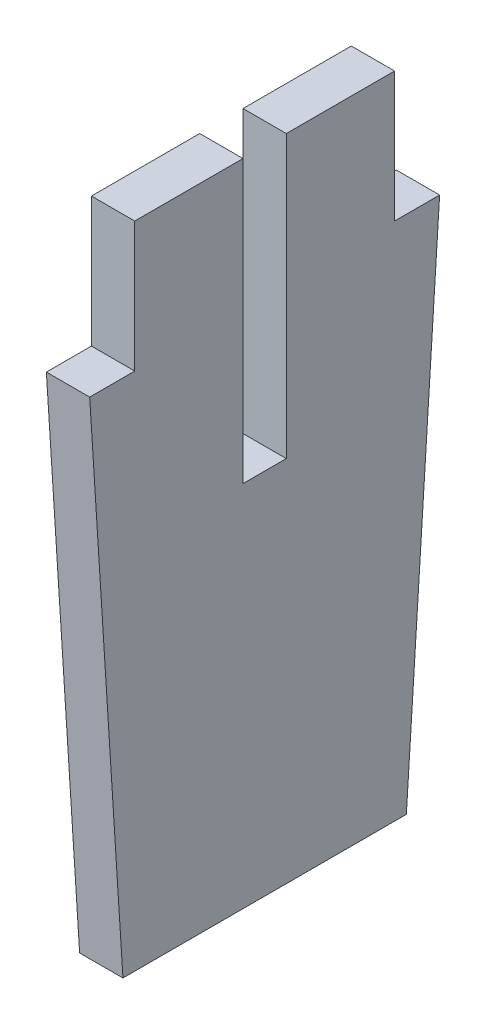
ISO-10303-21;
HEADER;
FILE_DESCRIPTION(('STEP AP214'),'2;1');
FILE_NAME('part.step','',(''),(''),'','','');
FILE_SCHEMA(('AUTOMOTIVE_DESIGN { 1 0 10303 214 1 1 1 1 }'));
ENDSEC;
DATA;
#1=APPLICATION_CONTEXT('core data for automotive mechanical design processes');
#2=APPLICATION_PROTOCOL_DEFINITION('international standard','automotive_design',2000,#1);
#3=PRODUCT_CONTEXT('',#1,'mechanical');
#4=PRODUCT('Part','Part','',(#3));
#5=PRODUCT_RELATED_PRODUCT_CATEGORY('part','',(#4));
#6=PRODUCT_DEFINITION_FORMATION('','',#4);
#7=PRODUCT_DEFINITION_CONTEXT('part definition',#1,'design');
#8=PRODUCT_DEFINITION('design','',#6,#7);
#9=PRODUCT_DEFINITION_SHAPE('','',#8);
#10=(LENGTH_UNIT() NAMED_UNIT(*) SI_UNIT(.MILLI.,.METRE.));
#11=(NAMED_UNIT(*) PLANE_ANGLE_UNIT() SI_UNIT($,.RADIAN.));
#12=(NAMED_UNIT(*) SI_UNIT($,.STERADIAN.) SOLID_ANGLE_UNIT());
#13=UNCERTAINTY_MEASURE_WITH_UNIT(LENGTH_MEASURE(1.E-05),#10,'distance_accuracy_value','');
#14=(GEOMETRIC_REPRESENTATION_CONTEXT(3) GLOBAL_UNCERTAINTY_ASSIGNED_CONTEXT((#13)) GLOBAL_UNIT_ASSIGNED_CONTEXT((#10,
#11,#12)) REPRESENTATION_CONTEXT('',''));
#15=CARTESIAN_POINT('',(0.,0.,0.));
#16=DIRECTION('',(0.,0.,1.));
#17=DIRECTION('',(1.,0.,0.));
#18=AXIS2_PLACEMENT_3D('',#15,#16,#17);
#19=CARTESIAN_POINT('',(3.175,47.625,0.));
#20=DIRECTION('',(0.,0.,-1.));
#21=DIRECTION('',(-1.,0.,0.));
#22=AXIS2_PLACEMENT_3D('',#19,#20,#21);
#23=PLANE('',#22);
#24=DIRECTION('',(0.,-1.,0.));
#25=VECTOR('',#24,1.);
#26=CARTESIAN_POINT('',(0.,47.625,0.));
#27=LINE('',#26,#25);
#28=CARTESIAN_POINT('',(0.,47.625,0.));
#29=VERTEX_POINT('',#28);
#30=CARTESIAN_POINT('',(0.,38.1,0.));
#31=VERTEX_POINT('',#30);
#32=EDGE_CURVE('E153',#29,#31,#27,.T.);
#33=ORIENTED_EDGE('',*,*,#32,.T.);
#34=DIRECTION('',(-1.,0.,0.));
#35=VECTOR('',#34,1.);
#36=CARTESIAN_POINT('',(3.175,38.1,0.));
#37=LINE('',#36,#35);
#38=CARTESIAN_POINT('',(3.175,38.1,0.));
#39=VERTEX_POINT('',#38);
#40=EDGE_CURVE('E11',#39,#31,#37,.T.);
#41=ORIENTED_EDGE('',*,*,#40,.F.);
#42=DIRECTION('',(0.,-1.,0.));
#43=VECTOR('',#42,1.);
#44=CARTESIAN_POINT('',(3.175,47.625,0.));
#45=LINE('',#44,#43);
#46=CARTESIAN_POINT('',(3.175,47.625,0.));
#47=VERTEX_POINT('',#46);
#48=EDGE_CURVE('E177',#47,#39,#45,.T.);
#49=ORIENTED_EDGE('',*,*,#48,.F.);
#50=DIRECTION('',(-1.,0.,0.));
#51=VECTOR('',#50,1.);
#52=CARTESIAN_POINT('',(3.175,47.625,0.));
#53=LINE('',#52,#51);
#54=EDGE_CURVE('E149',#47,#29,#53,.T.);
#55=ORIENTED_EDGE('',*,*,#54,.T.);
#56=EDGE_LOOP('',(#33,#41,#49,#55));
#57=FACE_BOUND('',#56,.T.);
#58=ADVANCED_FACE('F33',(#57),#23,.F.);
#59=CARTESIAN_POINT('',(3.175,38.1,0.));
#60=DIRECTION('',(0.,-1.,0.));
#61=DIRECTION('',(0.,0.,-1.));
#62=AXIS2_PLACEMENT_3D('',#59,#60,#61);
#63=PLANE('',#62);
#64=DIRECTION('',(0.,0.,1.));
#65=VECTOR('',#64,1.);
#66=CARTESIAN_POINT('',(0.,38.1,0.));
#67=LINE('',#66,#65);
#68=CARTESIAN_POINT('',(0.,38.1,3.302));
#69=VERTEX_POINT('',#68);
#70=EDGE_CURVE('E156',#31,#69,#67,.T.);
#71=ORIENTED_EDGE('',*,*,#70,.T.);
#72=DIRECTION('',(-1.,0.,0.));
#73=VECTOR('',#72,1.);
#74=CARTESIAN_POINT('',(3.175,38.1,3.302));
#75=LINE('',#74,#73);
#76=CARTESIAN_POINT('',(3.175,38.1,3.302));
#77=VERTEX_POINT('',#76);
#78=EDGE_CURVE('E41',#77,#69,#75,.T.);
#79=ORIENTED_EDGE('',*,*,#78,.F.);
#80=DIRECTION('',(0.,0.,1.));
#81=VECTOR('',#80,1.);
#82=CARTESIAN_POINT('',(3.175,38.1,0.));
#83=LINE('',#82,#81);
#84=EDGE_CURVE('E104',#39,#77,#83,.T.);
#85=ORIENTED_EDGE('',*,*,#84,.F.);
#86=ORIENTED_EDGE('',*,*,#40,.T.);
#87=EDGE_LOOP('',(#71,#79,#85,#86));
#88=FACE_BOUND('',#87,.T.);
#89=ADVANCED_FACE('F204',(#88),#63,.F.);
#90=CARTESIAN_POINT('',(3.175,6.35,1.27000000000001));
#91=DIRECTION('',(0.,0.0638693292837019,-0.997958270057847));
#92=DIRECTION('',(0.,0.997958270057847,0.063869329283702));
#93=AXIS2_PLACEMENT_3D('',#90,#91,#92);
#94=PLANE('',#93);
#95=DIRECTION('',(0.,-0.997958270057847,-0.0638693292837019));
#96=VECTOR('',#95,1.);
#97=CARTESIAN_POINT('',(0.,6.35,1.27000000000001));
#98=LINE('',#97,#96);
#99=CARTESIAN_POINT('',(0.,0.,0.86360000000001));
#100=VERTEX_POINT('',#99);
#101=EDGE_CURVE('E159',#69,#100,#98,.T.);
#102=ORIENTED_EDGE('',*,*,#101,.T.);
#103=DIRECTION('',(-1.,0.,0.));
#104=VECTOR('',#103,1.);
#105=CARTESIAN_POINT('',(3.175,0.,0.86360000000001));
#106=LINE('',#105,#104);
#107=CARTESIAN_POINT('',(3.175,0.,0.86360000000001));
#108=VERTEX_POINT('',#107);
#109=EDGE_CURVE('E196',#108,#100,#106,.T.);
#110=ORIENTED_EDGE('',*,*,#109,.F.);
#111=DIRECTION('',(0.,-0.997958270057847,-0.063869329283702));
#112=VECTOR('',#111,1.);
#113=CARTESIAN_POINT('',(3.175,38.1,3.302));
#114=LINE('',#113,#112);
#115=EDGE_CURVE('E203',#77,#108,#114,.T.);
#116=ORIENTED_EDGE('',*,*,#115,.F.);
#117=ORIENTED_EDGE('',*,*,#78,.T.);
#118=EDGE_LOOP('',(#102,#110,#116,#117));
#119=FACE_BOUND('',#118,.T.);
#120=ADVANCED_FACE('F201',(#119),#94,.F.);
#121=CARTESIAN_POINT('',(3.175,0.,0.86360000000001));
#122=DIRECTION('',(0.,1.,0.));
#123=DIRECTION('',(0.,0.,1.));
#124=AXIS2_PLACEMENT_3D('',#121,#122,#123);
#125=PLANE('',#124);
#126=DIRECTION('',(0.,0.,-1.));
#127=VECTOR('',#126,1.);
#128=CARTESIAN_POINT('',(0.,0.,0.86360000000001));
#129=LINE('',#128,#127);
#130=CARTESIAN_POINT('',(0.,0.,-19.9136));
#131=VERTEX_POINT('',#130);
#132=EDGE_CURVE('E161',#100,#131,#129,.T.);
#133=ORIENTED_EDGE('',*,*,#132,.T.);
#134=DIRECTION('',(-1.,0.,0.));
#135=VECTOR('',#134,1.);
#136=CARTESIAN_POINT('',(3.175,0.,-19.9136));
#137=LINE('',#136,#135);
#138=CARTESIAN_POINT('',(3.175,0.,-19.9136));
#139=VERTEX_POINT('',#138);
#140=EDGE_CURVE('E193',#139,#131,#137,.T.);
#141=ORIENTED_EDGE('',*,*,#140,.F.);
#142=DIRECTION('',(0.,0.,-1.));
#143=VECTOR('',#142,1.);
#144=CARTESIAN_POINT('',(3.175,0.,0.86360000000001));
#145=LINE('',#144,#143);
#146=EDGE_CURVE('E222',#108,#139,#145,.T.);
#147=ORIENTED_EDGE('',*,*,#146,.F.);
#148=ORIENTED_EDGE('',*,*,#109,.T.);
#149=EDGE_LOOP('',(#133,#141,#147,#148));
#150=FACE_BOUND('',#149,.T.);
#151=ADVANCED_FACE('F213',(#150),#125,.F.);
#152=CARTESIAN_POINT('',(3.175,38.1,-22.352));
#153=DIRECTION('',(0.,0.0638693292837024,0.997958270057847));
#154=DIRECTION('',(0.,-0.997958270057847,0.0638693292837024));
#155=AXIS2_PLACEMENT_3D('',#152,#153,#154);
#156=PLANE('',#155);
#157=DIRECTION('',(0.,0.997958270057847,-0.0638693292837024));
#158=VECTOR('',#157,1.);
#159=CARTESIAN_POINT('',(0.,38.1,-22.352));
#160=LINE('',#159,#158);
#161=CARTESIAN_POINT('',(0.,38.1,-22.352));
#162=VERTEX_POINT('',#161);
#163=EDGE_CURVE('E164',#131,#162,#160,.T.);
#164=ORIENTED_EDGE('',*,*,#163,.T.);
#165=DIRECTION('',(-1.,0.,0.));
#166=VECTOR('',#165,1.);
#167=CARTESIAN_POINT('',(3.175,38.1,-22.352));
#168=LINE('',#167,#166);
#169=CARTESIAN_POINT('',(3.175,38.1,-22.352));
#170=VERTEX_POINT('',#169);
#171=EDGE_CURVE('E190',#170,#162,#168,.T.);
#172=ORIENTED_EDGE('',*,*,#171,.F.);
#173=DIRECTION('',(0.,0.997958270057847,-0.0638693292837024));
#174=VECTOR('',#173,1.);
#175=CARTESIAN_POINT('',(3.175,6.35,-20.32));
#176=LINE('',#175,#174);
#177=EDGE_CURVE('E219',#139,#170,#176,.T.);
#178=ORIENTED_EDGE('',*,*,#177,.F.);
#179=ORIENTED_EDGE('',*,*,#140,.T.);
#180=EDGE_LOOP('',(#164,#172,#178,#179));
#181=FACE_BOUND('',#180,.T.);
#182=ADVANCED_FACE('F217',(#181),#156,.F.);
#183=CARTESIAN_POINT('',(3.175,38.1,-19.05));
#184=DIRECTION('',(0.,-1.,0.));
#185=DIRECTION('',(0.,0.,-1.));
#186=AXIS2_PLACEMENT_3D('',#183,#184,#185);
#187=PLANE('',#186);
#188=DIRECTION('',(0.,0.,1.));
#189=VECTOR('',#188,1.);
#190=CARTESIAN_POINT('',(0.,38.1,-19.05));
#191=LINE('',#190,#189);
#192=CARTESIAN_POINT('',(0.,38.1,-19.05));
#193=VERTEX_POINT('',#192);
#194=EDGE_CURVE('E166',#162,#193,#191,.T.);
#195=ORIENTED_EDGE('',*,*,#194,.T.);
#196=DIRECTION('',(-1.,0.,0.));
#197=VECTOR('',#196,1.);
#198=CARTESIAN_POINT('',(3.175,38.1,-19.05));
#199=LINE('',#198,#197);
#200=CARTESIAN_POINT('',(3.175,38.1,-19.05));
#201=VERTEX_POINT('',#200);
#202=EDGE_CURVE('E187',#201,#193,#199,.T.);
#203=ORIENTED_EDGE('',*,*,#202,.F.);
#204=DIRECTION('',(0.,0.,1.));
#205=VECTOR('',#204,1.);
#206=CARTESIAN_POINT('',(3.175,38.1,-19.05));
#207=LINE('',#206,#205);
#208=EDGE_CURVE('E221',#170,#201,#207,.T.);
#209=ORIENTED_EDGE('',*,*,#208,.F.);
#210=ORIENTED_EDGE('',*,*,#171,.T.);
#211=EDGE_LOOP('',(#195,#203,#209,#210));
#212=FACE_BOUND('',#211,.T.);
#213=ADVANCED_FACE('F246',(#212),#187,.F.);
#214=CARTESIAN_POINT('',(3.175,47.625,-19.05));
#215=DIRECTION('',(0.,0.,1.));
#216=DIRECTION('',(0.,-1.,0.));
#217=AXIS2_PLACEMENT_3D('',#214,#215,#216);
#218=PLANE('',#217);
#219=DIRECTION('',(0.,1.,0.));
#220=VECTOR('',#219,1.);
#221=CARTESIAN_POINT('',(0.,47.625,-19.05));
#222=LINE('',#221,#220);
#223=CARTESIAN_POINT('',(0.,47.625,-19.05));
#224=VERTEX_POINT('',#223);
#225=EDGE_CURVE('E168',#193,#224,#222,.T.);
#226=ORIENTED_EDGE('',*,*,#225,.T.);
#227=DIRECTION('',(-1.,0.,0.));
#228=VECTOR('',#227,1.);
#229=CARTESIAN_POINT('',(3.175,47.625,-19.05));
#230=LINE('',#229,#228);
#231=CARTESIAN_POINT('',(3.175,47.625,-19.05));
#232=VERTEX_POINT('',#231);
#233=EDGE_CURVE('E184',#232,#224,#230,.T.);
#234=ORIENTED_EDGE('',*,*,#233,.F.);
#235=DIRECTION('',(0.,1.,0.));
#236=VECTOR('',#235,1.);
#237=CARTESIAN_POINT('',(3.175,47.625,-19.05));
#238=LINE('',#237,#236);
#239=EDGE_CURVE('E224',#201,#232,#238,.T.);
#240=ORIENTED_EDGE('',*,*,#239,.F.);
#241=ORIENTED_EDGE('',*,*,#202,.T.);
#242=EDGE_LOOP('',(#226,#234,#240,#241));
#243=FACE_BOUND('',#242,.T.);
#244=ADVANCED_FACE('F243',(#243),#218,.F.);
#245=CARTESIAN_POINT('',(3.175,47.625,-11.1125));
#246=DIRECTION('',(0.,-1.,0.));
#247=DIRECTION('',(0.,0.,-1.));
#248=AXIS2_PLACEMENT_3D('',#245,#246,#247);
#249=PLANE('',#248);
#250=DIRECTION('',(0.,0.,1.));
#251=VECTOR('',#250,1.);
#252=CARTESIAN_POINT('',(0.,47.625,-11.1125));
#253=LINE('',#252,#251);
#254=CARTESIAN_POINT('',(0.,47.625,-11.1125));
#255=VERTEX_POINT('',#254);
#256=EDGE_CURVE('E170',#224,#255,#253,.T.);
#257=ORIENTED_EDGE('',*,*,#256,.T.);
#258=DIRECTION('',(-1.,0.,0.));
#259=VECTOR('',#258,1.);
#260=CARTESIAN_POINT('',(3.175,47.625,-11.1125));
#261=LINE('',#260,#259);
#262=CARTESIAN_POINT('',(3.175,47.625,-11.1125));
#263=VERTEX_POINT('',#262);
#264=EDGE_CURVE('E181',#263,#255,#261,.T.);
#265=ORIENTED_EDGE('',*,*,#264,.F.);
#266=DIRECTION('',(0.,0.,1.));
#267=VECTOR('',#266,1.);
#268=CARTESIAN_POINT('',(3.175,47.625,-11.1125));
#269=LINE('',#268,#267);
#270=EDGE_CURVE('E230',#232,#263,#269,.T.);
#271=ORIENTED_EDGE('',*,*,#270,.F.);
#272=ORIENTED_EDGE('',*,*,#233,.T.);
#273=EDGE_LOOP('',(#257,#265,#271,#272));
#274=FACE_BOUND('',#273,.T.);
#275=ADVANCED_FACE('F236',(#274),#249,.F.);
#276=CARTESIAN_POINT('',(3.175,47.625,-11.1125));
#277=DIRECTION('',(0.,0.,-1.));
#278=DIRECTION('',(0.,1.,0.));
#279=AXIS2_PLACEMENT_3D('',#276,#277,#278);
#280=PLANE('',#279);
#281=DIRECTION('',(0.,-1.,0.));
#282=VECTOR('',#281,1.);
#283=CARTESIAN_POINT('',(0.,47.625,-11.1125));
#284=LINE('',#283,#282);
#285=CARTESIAN_POINT('',(0.,26.9875,-11.1125));
#286=VERTEX_POINT('',#285);
#287=EDGE_CURVE('E172',#255,#286,#284,.T.);
#288=ORIENTED_EDGE('',*,*,#287,.T.);
#289=DIRECTION('',(-1.,0.,0.));
#290=VECTOR('',#289,1.);
#291=CARTESIAN_POINT('',(3.175,26.9875,-11.1125));
#292=LINE('',#291,#290);
#293=CARTESIAN_POINT('',(3.175,26.9875,-11.1125));
#294=VERTEX_POINT('',#293);
#295=EDGE_CURVE('E144',#294,#286,#292,.T.);
#296=ORIENTED_EDGE('',*,*,#295,.F.);
#297=DIRECTION('',(0.,-1.,0.));
#298=VECTOR('',#297,1.);
#299=CARTESIAN_POINT('',(3.175,47.625,-11.1125));
#300=LINE('',#299,#298);
#301=EDGE_CURVE('E135',#263,#294,#300,.T.);
#302=ORIENTED_EDGE('',*,*,#301,.F.);
#303=ORIENTED_EDGE('',*,*,#264,.T.);
#304=EDGE_LOOP('',(#288,#296,#302,#303));
#305=FACE_BOUND('',#304,.T.);
#306=ADVANCED_FACE('F240',(#305),#280,.F.);
#307=CARTESIAN_POINT('',(3.175,26.9875,-11.1125));
#308=DIRECTION('',(0.,-1.,0.));
#309=DIRECTION('',(0.,0.,-1.));
#310=AXIS2_PLACEMENT_3D('',#307,#308,#309);
#311=PLANE('',#310);
#312=DIRECTION('',(0.,0.,1.));
#313=VECTOR('',#312,1.);
#314=CARTESIAN_POINT('',(0.,26.9875,-11.1125));
#315=LINE('',#314,#313);
#316=CARTESIAN_POINT('',(0.,26.9875,-7.93749999999998));
#317=VERTEX_POINT('',#316);
#318=EDGE_CURVE('E143',#286,#317,#315,.T.);
#319=ORIENTED_EDGE('',*,*,#318,.T.);
#320=DIRECTION('',(-1.,0.,0.));
#321=VECTOR('',#320,1.);
#322=CARTESIAN_POINT('',(3.175,26.9875,-7.93749999999998));
#323=LINE('',#322,#321);
#324=CARTESIAN_POINT('',(3.175,26.9875,-7.93749999999998));
#325=VERTEX_POINT('',#324);
#326=EDGE_CURVE('E140',#325,#317,#323,.T.);
#327=ORIENTED_EDGE('',*,*,#326,.F.);
#328=DIRECTION('',(0.,0.,1.));
#329=VECTOR('',#328,1.);
#330=CARTESIAN_POINT('',(3.175,26.9875,-11.1125));
#331=LINE('',#330,#329);
#332=EDGE_CURVE('E129',#294,#325,#331,.T.);
#333=ORIENTED_EDGE('',*,*,#332,.F.);
#334=ORIENTED_EDGE('',*,*,#295,.T.);
#335=EDGE_LOOP('',(#319,#327,#333,#334));
#336=FACE_BOUND('',#335,.T.);
#337=ADVANCED_FACE('F141',(#336),#311,.F.);
#338=CARTESIAN_POINT('',(3.175,47.625,-7.93749999999999));
#339=DIRECTION('',(0.,0.,1.));
#340=DIRECTION('',(0.,-1.,0.));
#341=AXIS2_PLACEMENT_3D('',#338,#339,#340);
#342=PLANE('',#341);
#343=DIRECTION('',(0.,1.,0.));
#344=VECTOR('',#343,1.);
#345=CARTESIAN_POINT('',(0.,47.625,-7.93749999999999));
#346=LINE('',#345,#344);
#347=CARTESIAN_POINT('',(0.,47.625,-7.93749999999999));
#348=VERTEX_POINT('',#347);
#349=EDGE_CURVE('E90',#317,#348,#346,.T.);
#350=ORIENTED_EDGE('',*,*,#349,.T.);
#351=DIRECTION('',(-1.,0.,0.));
#352=VECTOR('',#351,1.);
#353=CARTESIAN_POINT('',(3.175,47.625,-7.93749999999999));
#354=LINE('',#353,#352);
#355=CARTESIAN_POINT('',(3.175,47.625,-7.93749999999999));
#356=VERTEX_POINT('',#355);
#357=EDGE_CURVE('E145',#356,#348,#354,.T.);
#358=ORIENTED_EDGE('',*,*,#357,.F.);
#359=DIRECTION('',(0.,1.,0.));
#360=VECTOR('',#359,1.);
#361=CARTESIAN_POINT('',(3.175,47.625,-7.93749999999999));
#362=LINE('',#361,#360);
#363=EDGE_CURVE('E133',#325,#356,#362,.T.);
#364=ORIENTED_EDGE('',*,*,#363,.F.);
#365=ORIENTED_EDGE('',*,*,#326,.T.);
#366=EDGE_LOOP('',(#350,#358,#364,#365));
#367=FACE_BOUND('',#366,.T.);
#368=ADVANCED_FACE('F147',(#367),#342,.F.);
#369=CARTESIAN_POINT('',(3.175,47.625,0.));
#370=DIRECTION('',(0.,-1.,0.));
#371=DIRECTION('',(0.,0.,-1.));
#372=AXIS2_PLACEMENT_3D('',#369,#370,#371);
#373=PLANE('',#372);
#374=DIRECTION('',(0.,0.,1.));
#375=VECTOR('',#374,1.);
#376=CARTESIAN_POINT('',(0.,47.625,0.));
#377=LINE('',#376,#375);
#378=EDGE_CURVE('E96',#348,#29,#377,.T.);
#379=ORIENTED_EDGE('',*,*,#378,.T.);
#380=ORIENTED_EDGE('',*,*,#54,.F.);
#381=DIRECTION('',(0.,0.,1.));
#382=VECTOR('',#381,1.);
#383=CARTESIAN_POINT('',(3.175,47.625,0.));
#384=LINE('',#383,#382);
#385=EDGE_CURVE('E49',#356,#47,#384,.T.);
#386=ORIENTED_EDGE('',*,*,#385,.F.);
#387=ORIENTED_EDGE('',*,*,#357,.T.);
#388=EDGE_LOOP('',(#379,#380,#386,#387));
#389=FACE_BOUND('',#388,.T.);
#390=ADVANCED_FACE('F261',(#389),#373,.F.);
#391=CARTESIAN_POINT('',(3.175,0.,0.));
#392=DIRECTION('',(-1.,0.,0.));
#393=DIRECTION('',(0.,0.,1.));
#394=AXIS2_PLACEMENT_3D('',#391,#392,#393);
#395=PLANE('',#394);
#396=ORIENTED_EDGE('',*,*,#48,.T.);
#397=ORIENTED_EDGE('',*,*,#84,.T.);
#398=ORIENTED_EDGE('',*,*,#115,.T.);
#399=ORIENTED_EDGE('',*,*,#146,.T.);
#400=ORIENTED_EDGE('',*,*,#177,.T.);
#401=ORIENTED_EDGE('',*,*,#208,.T.);
#402=ORIENTED_EDGE('',*,*,#239,.T.);
#403=ORIENTED_EDGE('',*,*,#270,.T.);
#404=ORIENTED_EDGE('',*,*,#301,.T.);
#405=ORIENTED_EDGE('',*,*,#332,.T.);
#406=ORIENTED_EDGE('',*,*,#363,.T.);
#407=ORIENTED_EDGE('',*,*,#385,.T.);
#408=EDGE_LOOP('',(#396,#397,#398,#399,#400,#401,#402,#403,#404,#405,#406,#407));
#409=FACE_BOUND('',#408,.T.);
#410=ADVANCED_FACE('F131',(#409),#395,.F.);
#411=CARTESIAN_POINT('',(0.,0.,0.));
#412=DIRECTION('',(-1.,0.,0.));
#413=DIRECTION('',(0.,0.,1.));
#414=AXIS2_PLACEMENT_3D('',#411,#412,#413);
#415=PLANE('',#414);
#416=ORIENTED_EDGE('',*,*,#32,.F.);
#417=ORIENTED_EDGE('',*,*,#378,.F.);
#418=ORIENTED_EDGE('',*,*,#349,.F.);
#419=ORIENTED_EDGE('',*,*,#318,.F.);
#420=ORIENTED_EDGE('',*,*,#287,.F.);
#421=ORIENTED_EDGE('',*,*,#256,.F.);
#422=ORIENTED_EDGE('',*,*,#225,.F.);
#423=ORIENTED_EDGE('',*,*,#194,.F.);
#424=ORIENTED_EDGE('',*,*,#163,.F.);
#425=ORIENTED_EDGE('',*,*,#132,.F.);
#426=ORIENTED_EDGE('',*,*,#101,.F.);
#427=ORIENTED_EDGE('',*,*,#70,.F.);
#428=EDGE_LOOP('',(#416,#417,#418,#419,#420,#421,#422,#423,#424,#425,#426,#427));
#429=FACE_BOUND('',#428,.T.);
#430=ADVANCED_FACE('F208',(#429),#415,.T.);
#431=CLOSED_SHELL('',(#58,#89,#120,#151,#182,#213,#244,#275,#306,#337,#368,#390,#410,#430));
#432=MANIFOLD_SOLID_BREP('B2',#431);
#433=ADVANCED_BREP_SHAPE_REPRESENTATION('',(#18,#432),#14);
#434=SHAPE_DEFINITION_REPRESENTATION(#9,#433);
ENDSEC;
END-ISO-10303-21;
